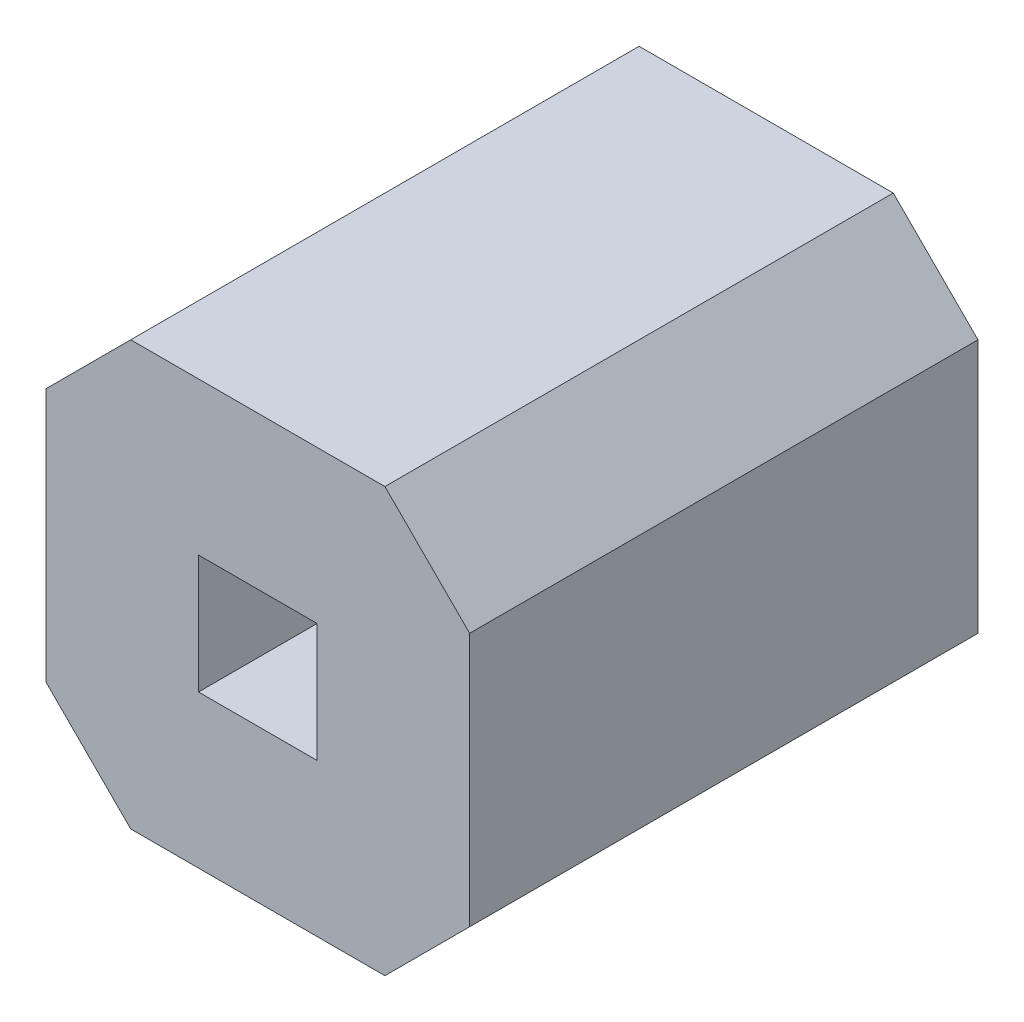
ISO-10303-21;
HEADER;
FILE_DESCRIPTION(('STEP AP214'),'2;1');
FILE_NAME('part.step','',(''),(''),'','','');
FILE_SCHEMA(('AUTOMOTIVE_DESIGN { 1 0 10303 214 1 1 1 1 }'));
ENDSEC;
DATA;
#1=APPLICATION_CONTEXT('core data for automotive mechanical design processes');
#2=APPLICATION_PROTOCOL_DEFINITION('international standard','automotive_design',2000,#1);
#3=PRODUCT_CONTEXT('',#1,'mechanical');
#4=PRODUCT('Part','Part','',(#3));
#5=PRODUCT_RELATED_PRODUCT_CATEGORY('part','',(#4));
#6=PRODUCT_DEFINITION_FORMATION('','',#4);
#7=PRODUCT_DEFINITION_CONTEXT('part definition',#1,'design');
#8=PRODUCT_DEFINITION('design','',#6,#7);
#9=PRODUCT_DEFINITION_SHAPE('','',#8);
#10=(LENGTH_UNIT() NAMED_UNIT(*) SI_UNIT(.MILLI.,.METRE.));
#11=(NAMED_UNIT(*) PLANE_ANGLE_UNIT() SI_UNIT($,.RADIAN.));
#12=(NAMED_UNIT(*) SI_UNIT($,.STERADIAN.) SOLID_ANGLE_UNIT());
#13=UNCERTAINTY_MEASURE_WITH_UNIT(LENGTH_MEASURE(1.E-05),#10,'distance_accuracy_value','');
#14=(GEOMETRIC_REPRESENTATION_CONTEXT(3) GLOBAL_UNCERTAINTY_ASSIGNED_CONTEXT((#13)) GLOBAL_UNIT_ASSIGNED_CONTEXT((#10,
#11,#12)) REPRESENTATION_CONTEXT('',''));
#15=CARTESIAN_POINT('',(0.,0.,0.));
#16=DIRECTION('',(0.,0.,1.));
#17=DIRECTION('',(1.,0.,0.));
#18=AXIS2_PLACEMENT_3D('',#15,#16,#17);
#19=CARTESIAN_POINT('',(33.58984299793,37.4,3.24));
#20=DIRECTION('',(0.,1.,0.));
#21=DIRECTION('',(1.,0.,0.));
#22=AXIS2_PLACEMENT_3D('',#19,#20,#21);
#23=PLANE('',#22);
#24=DIRECTION('',(0.,0.,-1.));
#25=VECTOR('',#24,1.);
#26=CARTESIAN_POINT('',(33.33584299794,37.40000000001,3.24000000001));
#27=LINE('',#26,#25);
#28=CARTESIAN_POINT('',(33.33584299793,37.4,3.24));
#29=VERTEX_POINT('',#28);
#30=CARTESIAN_POINT('',(33.33584299793,37.4,1.716));
#31=VERTEX_POINT('',#30);
#32=EDGE_CURVE('E39',#29,#31,#27,.T.);
#33=ORIENTED_EDGE('',*,*,#32,.F.);
#34=DIRECTION('',(-1.,0.,0.));
#35=VECTOR('',#34,1.);
#36=CARTESIAN_POINT('',(33.33584299794,37.40000000001,3.24000000001));
#37=LINE('',#36,#35);
#38=CARTESIAN_POINT('',(32.57384299793,37.4,3.24));
#39=VERTEX_POINT('',#38);
#40=EDGE_CURVE('E11',#29,#39,#37,.T.);
#41=ORIENTED_EDGE('',*,*,#40,.T.);
#42=DIRECTION('',(0.,0.,1.));
#43=VECTOR('',#42,1.);
#44=CARTESIAN_POINT('',(32.57384299794,37.40000000001,1.71600000001));
#45=LINE('',#44,#43);
#46=CARTESIAN_POINT('',(32.57384299793,37.4,1.716));
#47=VERTEX_POINT('',#46);
#48=EDGE_CURVE('E190',#47,#39,#45,.T.);
#49=ORIENTED_EDGE('',*,*,#48,.F.);
#50=DIRECTION('',(-1.,0.,0.));
#51=VECTOR('',#50,1.);
#52=CARTESIAN_POINT('',(33.33584299794,37.40000000001,1.71600000001));
#53=LINE('',#52,#51);
#54=EDGE_CURVE('E226',#31,#47,#53,.T.);
#55=ORIENTED_EDGE('',*,*,#54,.F.);
#56=EDGE_LOOP('',(#33,#41,#49,#55));
#57=FACE_BOUND('',#56,.T.);
#58=ADVANCED_FACE('F17',(#57),#23,.F.);
#59=CARTESIAN_POINT('',(32.31984299793,37.4,1.716));
#60=DIRECTION('',(0.,0.,-1.));
#61=DIRECTION('',(0.,-1.,0.));
#62=AXIS2_PLACEMENT_3D('',#59,#60,#61);
#63=PLANE('',#62);
#64=DIRECTION('',(-0.707106781186498,-0.707106781186598,0.));
#65=VECTOR('',#64,1.);
#66=CARTESIAN_POINT('',(33.58984299794,37.65400000001,1.71600000001));
#67=LINE('',#66,#65);
#68=CARTESIAN_POINT('',(33.58984299793,37.654,1.716));
#69=VERTEX_POINT('',#68);
#70=EDGE_CURVE('E28',#69,#31,#67,.T.);
#71=ORIENTED_EDGE('',*,*,#70,.T.);
#72=ORIENTED_EDGE('',*,*,#54,.T.);
#73=DIRECTION('',(-0.707106781186498,0.707106781186598,0.));
#74=VECTOR('',#73,1.);
#75=CARTESIAN_POINT('',(32.57384299794,37.40000000001,1.71600000001));
#76=LINE('',#75,#74);
#77=CARTESIAN_POINT('',(32.31984299793,37.654,1.716));
#78=VERTEX_POINT('',#77);
#79=EDGE_CURVE('E195',#47,#78,#76,.T.);
#80=ORIENTED_EDGE('',*,*,#79,.T.);
#81=DIRECTION('',(0.,1.,0.));
#82=VECTOR('',#81,1.);
#83=CARTESIAN_POINT('',(32.31984299794,37.65400000001,1.71600000001));
#84=LINE('',#83,#82);
#85=CARTESIAN_POINT('',(32.31984299793,38.416,1.716));
#86=VERTEX_POINT('',#85);
#87=EDGE_CURVE('E192',#78,#86,#84,.T.);
#88=ORIENTED_EDGE('',*,*,#87,.T.);
#89=DIRECTION('',(0.707106781186548,0.707106781186548,0.));
#90=VECTOR('',#89,1.);
#91=CARTESIAN_POINT('',(32.31984299794,38.41600000001,1.71600000001));
#92=LINE('',#91,#90);
#93=CARTESIAN_POINT('',(32.57384299793,38.67,1.716));
#94=VERTEX_POINT('',#93);
#95=EDGE_CURVE('E196',#86,#94,#92,.T.);
#96=ORIENTED_EDGE('',*,*,#95,.T.);
#97=DIRECTION('',(1.,0.,0.));
#98=VECTOR('',#97,1.);
#99=CARTESIAN_POINT('',(32.57384299794,38.67000000001,1.71600000001));
#100=LINE('',#99,#98);
#101=CARTESIAN_POINT('',(33.33584299793,38.67,1.716));
#102=VERTEX_POINT('',#101);
#103=EDGE_CURVE('E244',#94,#102,#100,.T.);
#104=ORIENTED_EDGE('',*,*,#103,.T.);
#105=DIRECTION('',(0.707106781186498,-0.707106781186598,0.));
#106=VECTOR('',#105,1.);
#107=CARTESIAN_POINT('',(33.33584299794,38.67000000001,1.71600000001));
#108=LINE('',#107,#106);
#109=CARTESIAN_POINT('',(33.58984299793,38.416,1.716));
#110=VERTEX_POINT('',#109);
#111=EDGE_CURVE('E185',#102,#110,#108,.T.);
#112=ORIENTED_EDGE('',*,*,#111,.T.);
#113=DIRECTION('',(0.,-1.,0.));
#114=VECTOR('',#113,1.);
#115=CARTESIAN_POINT('',(33.58984299794,38.41600000001,1.71600000001));
#116=LINE('',#115,#114);
#117=EDGE_CURVE('E129',#110,#69,#116,.T.);
#118=ORIENTED_EDGE('',*,*,#117,.T.);
#119=EDGE_LOOP('',(#71,#72,#80,#88,#96,#104,#112,#118));
#120=FACE_BOUND('',#119,.T.);
#121=DIRECTION('',(0.,-1.,0.));
#122=VECTOR('',#121,1.);
#123=CARTESIAN_POINT('',(33.13264299794,38.21280000001,1.71600000001));
#124=LINE('',#123,#122);
#125=CARTESIAN_POINT('',(33.13264299793,38.2128,1.716));
#126=VERTEX_POINT('',#125);
#127=CARTESIAN_POINT('',(33.13264299793,37.8572,1.716));
#128=VERTEX_POINT('',#127);
#129=EDGE_CURVE('E176',#126,#128,#124,.T.);
#130=ORIENTED_EDGE('',*,*,#129,.F.);
#131=DIRECTION('',(1.,0.,0.));
#132=VECTOR('',#131,1.);
#133=CARTESIAN_POINT('',(32.77704299794,38.21280000001,1.71600000001));
#134=LINE('',#133,#132);
#135=CARTESIAN_POINT('',(32.77704299793,38.2128,1.716));
#136=VERTEX_POINT('',#135);
#137=EDGE_CURVE('E118',#136,#126,#134,.T.);
#138=ORIENTED_EDGE('',*,*,#137,.F.);
#139=DIRECTION('',(0.,1.,0.));
#140=VECTOR('',#139,1.);
#141=CARTESIAN_POINT('',(32.77704299794,37.85720000001,1.71600000001));
#142=LINE('',#141,#140);
#143=CARTESIAN_POINT('',(32.77704299793,37.8572,1.716));
#144=VERTEX_POINT('',#143);
#145=EDGE_CURVE('E174',#144,#136,#142,.T.);
#146=ORIENTED_EDGE('',*,*,#145,.F.);
#147=DIRECTION('',(-1.,0.,0.));
#148=VECTOR('',#147,1.);
#149=CARTESIAN_POINT('',(33.13264299794,37.85720000001,1.71600000001));
#150=LINE('',#149,#148);
#151=EDGE_CURVE('E257',#128,#144,#150,.T.);
#152=ORIENTED_EDGE('',*,*,#151,.F.);
#153=EDGE_LOOP('',(#130,#138,#146,#152));
#154=FACE_BOUND('',#153,.T.);
#155=ADVANCED_FACE('F301',(#120,#154),#63,.T.);
#156=CARTESIAN_POINT('',(33.13264299793,37.8572,1.716));
#157=DIRECTION('',(0.,-1.,0.));
#158=DIRECTION('',(0.,0.,-1.));
#159=AXIS2_PLACEMENT_3D('',#156,#157,#158);
#160=PLANE('',#159);
#161=DIRECTION('',(0.,0.,-1.));
#162=VECTOR('',#161,1.);
#163=CARTESIAN_POINT('',(33.13264299794,37.85720000001,3.24000000001));
#164=LINE('',#163,#162);
#165=CARTESIAN_POINT('',(33.13264299793,37.8572,3.24));
#166=VERTEX_POINT('',#165);
#167=EDGE_CURVE('E254',#166,#128,#164,.T.);
#168=ORIENTED_EDGE('',*,*,#167,.T.);
#169=ORIENTED_EDGE('',*,*,#151,.T.);
#170=DIRECTION('',(0.,0.,-1.));
#171=VECTOR('',#170,1.);
#172=CARTESIAN_POINT('',(32.77704299794,37.85720000001,3.24000000001));
#173=LINE('',#172,#171);
#174=CARTESIAN_POINT('',(32.77704299793,37.8572,3.24));
#175=VERTEX_POINT('',#174);
#176=EDGE_CURVE('E94',#175,#144,#173,.T.);
#177=ORIENTED_EDGE('',*,*,#176,.F.);
#178=DIRECTION('',(-1.,0.,0.));
#179=VECTOR('',#178,1.);
#180=CARTESIAN_POINT('',(33.13264299794,37.85720000001,3.24000000001));
#181=LINE('',#180,#179);
#182=EDGE_CURVE('E100',#166,#175,#181,.T.);
#183=ORIENTED_EDGE('',*,*,#182,.F.);
#184=EDGE_LOOP('',(#168,#169,#177,#183));
#185=FACE_BOUND('',#184,.T.);
#186=ADVANCED_FACE('F308',(#185),#160,.F.);
#187=CARTESIAN_POINT('',(32.31984299793,37.4,3.24));
#188=DIRECTION('',(0.,0.,-1.));
#189=DIRECTION('',(0.,-1.,0.));
#190=AXIS2_PLACEMENT_3D('',#187,#188,#189);
#191=PLANE('',#190);
#192=DIRECTION('',(0.707106781186498,0.707106781186598,0.));
#193=VECTOR('',#192,1.);
#194=CARTESIAN_POINT('',(33.33584299794,37.40000000001,3.24000000001));
#195=LINE('',#194,#193);
#196=CARTESIAN_POINT('',(33.58984299793,37.654,3.24));
#197=VERTEX_POINT('',#196);
#198=EDGE_CURVE('E21',#29,#197,#195,.T.);
#199=ORIENTED_EDGE('',*,*,#198,.T.);
#200=DIRECTION('',(0.,-1.,0.));
#201=VECTOR('',#200,1.);
#202=CARTESIAN_POINT('',(33.58984299794,38.41600000001,3.24000000001));
#203=LINE('',#202,#201);
#204=CARTESIAN_POINT('',(33.58984299793,38.416,3.24));
#205=VERTEX_POINT('',#204);
#206=EDGE_CURVE('E212',#205,#197,#203,.T.);
#207=ORIENTED_EDGE('',*,*,#206,.F.);
#208=DIRECTION('',(-0.707106781186498,0.707106781186598,0.));
#209=VECTOR('',#208,1.);
#210=CARTESIAN_POINT('',(33.58984299794,38.41600000001,3.24000000001));
#211=LINE('',#210,#209);
#212=CARTESIAN_POINT('',(33.33584299793,38.67,3.24));
#213=VERTEX_POINT('',#212);
#214=EDGE_CURVE('E225',#205,#213,#211,.T.);
#215=ORIENTED_EDGE('',*,*,#214,.T.);
#216=DIRECTION('',(1.,0.,0.));
#217=VECTOR('',#216,1.);
#218=CARTESIAN_POINT('',(32.57384299794,38.67000000001,3.24000000001));
#219=LINE('',#218,#217);
#220=CARTESIAN_POINT('',(32.57384299793,38.67,3.24));
#221=VERTEX_POINT('',#220);
#222=EDGE_CURVE('E207',#221,#213,#219,.T.);
#223=ORIENTED_EDGE('',*,*,#222,.F.);
#224=DIRECTION('',(-0.707106781186548,-0.707106781186548,0.));
#225=VECTOR('',#224,1.);
#226=CARTESIAN_POINT('',(32.57384299794,38.67000000001,3.24000000001));
#227=LINE('',#226,#225);
#228=CARTESIAN_POINT('',(32.31984299793,38.416,3.24));
#229=VERTEX_POINT('',#228);
#230=EDGE_CURVE('E221',#221,#229,#227,.T.);
#231=ORIENTED_EDGE('',*,*,#230,.T.);
#232=DIRECTION('',(0.,1.,0.));
#233=VECTOR('',#232,1.);
#234=CARTESIAN_POINT('',(32.31984299794,37.65400000001,3.24000000001));
#235=LINE('',#234,#233);
#236=CARTESIAN_POINT('',(32.31984299793,37.654,3.24));
#237=VERTEX_POINT('',#236);
#238=EDGE_CURVE('E213',#237,#229,#235,.T.);
#239=ORIENTED_EDGE('',*,*,#238,.F.);
#240=DIRECTION('',(0.707106781186498,-0.707106781186598,0.));
#241=VECTOR('',#240,1.);
#242=CARTESIAN_POINT('',(32.31984299794,37.65400000001,3.24000000001));
#243=LINE('',#242,#241);
#244=EDGE_CURVE('E202',#237,#39,#243,.T.);
#245=ORIENTED_EDGE('',*,*,#244,.T.);
#246=ORIENTED_EDGE('',*,*,#40,.F.);
#247=EDGE_LOOP('',(#199,#207,#215,#223,#231,#239,#245,#246));
#248=FACE_BOUND('',#247,.T.);
#249=ORIENTED_EDGE('',*,*,#182,.T.);
#250=DIRECTION('',(0.,1.,0.));
#251=VECTOR('',#250,1.);
#252=CARTESIAN_POINT('',(32.77704299794,37.85720000001,3.24000000001));
#253=LINE('',#252,#251);
#254=CARTESIAN_POINT('',(32.77704299793,38.2128,3.24));
#255=VERTEX_POINT('',#254);
#256=EDGE_CURVE('E166',#175,#255,#253,.T.);
#257=ORIENTED_EDGE('',*,*,#256,.T.);
#258=DIRECTION('',(1.,0.,0.));
#259=VECTOR('',#258,1.);
#260=CARTESIAN_POINT('',(32.77704299794,38.21280000001,3.24000000001));
#261=LINE('',#260,#259);
#262=CARTESIAN_POINT('',(33.13264299793,38.2128,3.24));
#263=VERTEX_POINT('',#262);
#264=EDGE_CURVE('E158',#255,#263,#261,.T.);
#265=ORIENTED_EDGE('',*,*,#264,.T.);
#266=DIRECTION('',(0.,-1.,0.));
#267=VECTOR('',#266,1.);
#268=CARTESIAN_POINT('',(33.13264299794,38.21280000001,3.24000000001));
#269=LINE('',#268,#267);
#270=EDGE_CURVE('E154',#263,#166,#269,.T.);
#271=ORIENTED_EDGE('',*,*,#270,.T.);
#272=EDGE_LOOP('',(#249,#257,#265,#271));
#273=FACE_BOUND('',#272,.T.);
#274=ADVANCED_FACE('F169',(#248,#273),#191,.F.);
#275=CARTESIAN_POINT('',(33.13264299793,37.8572,1.716));
#276=DIRECTION('',(1.,0.,0.));
#277=DIRECTION('',(0.,1.,0.));
#278=AXIS2_PLACEMENT_3D('',#275,#276,#277);
#279=PLANE('',#278);
#280=DIRECTION('',(0.,0.,-1.));
#281=VECTOR('',#280,1.);
#282=CARTESIAN_POINT('',(33.13264299794,38.21280000001,3.24000000001));
#283=LINE('',#282,#281);
#284=EDGE_CURVE('E163',#263,#126,#283,.T.);
#285=ORIENTED_EDGE('',*,*,#284,.T.);
#286=ORIENTED_EDGE('',*,*,#129,.T.);
#287=ORIENTED_EDGE('',*,*,#167,.F.);
#288=ORIENTED_EDGE('',*,*,#270,.F.);
#289=EDGE_LOOP('',(#285,#286,#287,#288));
#290=FACE_BOUND('',#289,.T.);
#291=ADVANCED_FACE('F313',(#290),#279,.F.);
#292=CARTESIAN_POINT('',(33.13264299793,38.2128,1.716));
#293=DIRECTION('',(0.,1.,0.));
#294=DIRECTION('',(1.,0.,0.));
#295=AXIS2_PLACEMENT_3D('',#292,#293,#294);
#296=PLANE('',#295);
#297=DIRECTION('',(0.,0.,-1.));
#298=VECTOR('',#297,1.);
#299=CARTESIAN_POINT('',(32.77704299794,38.21280000001,3.24000000001));
#300=LINE('',#299,#298);
#301=EDGE_CURVE('E162',#255,#136,#300,.T.);
#302=ORIENTED_EDGE('',*,*,#301,.T.);
#303=ORIENTED_EDGE('',*,*,#137,.T.);
#304=ORIENTED_EDGE('',*,*,#284,.F.);
#305=ORIENTED_EDGE('',*,*,#264,.F.);
#306=EDGE_LOOP('',(#302,#303,#304,#305));
#307=FACE_BOUND('',#306,.T.);
#308=ADVANCED_FACE('F160',(#307),#296,.F.);
#309=CARTESIAN_POINT('',(32.77704299793,37.8572,1.716));
#310=DIRECTION('',(-1.,0.,0.));
#311=DIRECTION('',(0.,0.,1.));
#312=AXIS2_PLACEMENT_3D('',#309,#310,#311);
#313=PLANE('',#312);
#314=ORIENTED_EDGE('',*,*,#176,.T.);
#315=ORIENTED_EDGE('',*,*,#145,.T.);
#316=ORIENTED_EDGE('',*,*,#301,.F.);
#317=ORIENTED_EDGE('',*,*,#256,.F.);
#318=EDGE_LOOP('',(#314,#315,#316,#317));
#319=FACE_BOUND('',#318,.T.);
#320=ADVANCED_FACE('F173',(#319),#313,.F.);
#321=CARTESIAN_POINT('',(32.57384299793,37.4,3.24));
#322=DIRECTION('',(0.707106781186598,0.707106781186498,0.));
#323=DIRECTION('',(0.,0.,-1.));
#324=AXIS2_PLACEMENT_3D('',#321,#322,#323);
#325=PLANE('',#324);
#326=DIRECTION('',(0.,0.,-1.));
#327=VECTOR('',#326,1.);
#328=CARTESIAN_POINT('',(32.31984299794,37.65400000001,3.24000000001));
#329=LINE('',#328,#327);
#330=EDGE_CURVE('E187',#237,#78,#329,.T.);
#331=ORIENTED_EDGE('',*,*,#330,.T.);
#332=ORIENTED_EDGE('',*,*,#79,.F.);
#333=ORIENTED_EDGE('',*,*,#48,.T.);
#334=ORIENTED_EDGE('',*,*,#244,.F.);
#335=EDGE_LOOP('',(#331,#332,#333,#334));
#336=FACE_BOUND('',#335,.T.);
#337=ADVANCED_FACE('F298',(#336),#325,.F.);
#338=CARTESIAN_POINT('',(32.31984299793,37.4,3.24));
#339=DIRECTION('',(1.,0.,0.));
#340=DIRECTION('',(0.,1.,0.));
#341=AXIS2_PLACEMENT_3D('',#338,#339,#340);
#342=PLANE('',#341);
#343=ORIENTED_EDGE('',*,*,#330,.F.);
#344=ORIENTED_EDGE('',*,*,#238,.T.);
#345=DIRECTION('',(0.,0.,1.));
#346=VECTOR('',#345,1.);
#347=CARTESIAN_POINT('',(32.31984299794,38.41600000001,1.71600000001));
#348=LINE('',#347,#346);
#349=EDGE_CURVE('E233',#86,#229,#348,.T.);
#350=ORIENTED_EDGE('',*,*,#349,.F.);
#351=ORIENTED_EDGE('',*,*,#87,.F.);
#352=EDGE_LOOP('',(#343,#344,#350,#351));
#353=FACE_BOUND('',#352,.T.);
#354=ADVANCED_FACE('F295',(#353),#342,.F.);
#355=CARTESIAN_POINT('',(32.31984299793,38.416,3.24));
#356=DIRECTION('',(0.707106781186498,-0.707106781186598,0.));
#357=DIRECTION('',(0.,0.,-1.));
#358=AXIS2_PLACEMENT_3D('',#355,#356,#357);
#359=PLANE('',#358);
#360=DIRECTION('',(0.,0.,-1.));
#361=VECTOR('',#360,1.);
#362=CARTESIAN_POINT('',(32.57384299794,38.67000000001,3.24000000001));
#363=LINE('',#362,#361);
#364=EDGE_CURVE('E216',#221,#94,#363,.T.);
#365=ORIENTED_EDGE('',*,*,#364,.T.);
#366=ORIENTED_EDGE('',*,*,#95,.F.);
#367=ORIENTED_EDGE('',*,*,#349,.T.);
#368=ORIENTED_EDGE('',*,*,#230,.F.);
#369=EDGE_LOOP('',(#365,#366,#367,#368));
#370=FACE_BOUND('',#369,.T.);
#371=ADVANCED_FACE('F291',(#370),#359,.F.);
#372=CARTESIAN_POINT('',(33.58984299793,38.67,3.24));
#373=DIRECTION('',(0.,-1.,0.));
#374=DIRECTION('',(0.,0.,-1.));
#375=AXIS2_PLACEMENT_3D('',#372,#373,#374);
#376=PLANE('',#375);
#377=ORIENTED_EDGE('',*,*,#364,.F.);
#378=ORIENTED_EDGE('',*,*,#222,.T.);
#379=DIRECTION('',(0.,0.,1.));
#380=VECTOR('',#379,1.);
#381=CARTESIAN_POINT('',(33.33584299794,38.67000000001,1.71600000001));
#382=LINE('',#381,#380);
#383=EDGE_CURVE('E208',#102,#213,#382,.T.);
#384=ORIENTED_EDGE('',*,*,#383,.F.);
#385=ORIENTED_EDGE('',*,*,#103,.F.);
#386=EDGE_LOOP('',(#377,#378,#384,#385));
#387=FACE_BOUND('',#386,.T.);
#388=ADVANCED_FACE('F19',(#387),#376,.F.);
#389=CARTESIAN_POINT('',(33.33584299793,38.67,3.24));
#390=DIRECTION('',(-0.707106781186598,-0.707106781186498,0.));
#391=DIRECTION('',(-0.707106781186498,0.707106781186598,0.));
#392=AXIS2_PLACEMENT_3D('',#389,#390,#391);
#393=PLANE('',#392);
#394=DIRECTION('',(0.,0.,-1.));
#395=VECTOR('',#394,1.);
#396=CARTESIAN_POINT('',(33.58984299794,38.41600000001,3.24000000001));
#397=LINE('',#396,#395);
#398=EDGE_CURVE('E203',#205,#110,#397,.T.);
#399=ORIENTED_EDGE('',*,*,#398,.T.);
#400=ORIENTED_EDGE('',*,*,#111,.F.);
#401=ORIENTED_EDGE('',*,*,#383,.T.);
#402=ORIENTED_EDGE('',*,*,#214,.F.);
#403=EDGE_LOOP('',(#399,#400,#401,#402));
#404=FACE_BOUND('',#403,.T.);
#405=ADVANCED_FACE('F335',(#404),#393,.F.);
#406=CARTESIAN_POINT('',(33.58984299793,37.4,3.24));
#407=DIRECTION('',(-1.,0.,0.));
#408=DIRECTION('',(0.,0.,1.));
#409=AXIS2_PLACEMENT_3D('',#406,#407,#408);
#410=PLANE('',#409);
#411=DIRECTION('',(0.,0.,1.));
#412=VECTOR('',#411,1.);
#413=CARTESIAN_POINT('',(33.58984299794,37.65400000001,1.71600000001));
#414=LINE('',#413,#412);
#415=EDGE_CURVE('E250',#69,#197,#414,.T.);
#416=ORIENTED_EDGE('',*,*,#415,.F.);
#417=ORIENTED_EDGE('',*,*,#117,.F.);
#418=ORIENTED_EDGE('',*,*,#398,.F.);
#419=ORIENTED_EDGE('',*,*,#206,.T.);
#420=EDGE_LOOP('',(#416,#417,#418,#419));
#421=FACE_BOUND('',#420,.T.);
#422=ADVANCED_FACE('F269',(#421),#410,.F.);
#423=CARTESIAN_POINT('',(33.58984299793,37.654,3.24));
#424=DIRECTION('',(-0.707106781186498,0.707106781186598,0.));
#425=DIRECTION('',(0.,0.,1.));
#426=AXIS2_PLACEMENT_3D('',#423,#424,#425);
#427=PLANE('',#426);
#428=ORIENTED_EDGE('',*,*,#32,.T.);
#429=ORIENTED_EDGE('',*,*,#70,.F.);
#430=ORIENTED_EDGE('',*,*,#415,.T.);
#431=ORIENTED_EDGE('',*,*,#198,.F.);
#432=EDGE_LOOP('',(#428,#429,#430,#431));
#433=FACE_BOUND('',#432,.T.);
#434=ADVANCED_FACE('F266',(#433),#427,.F.);
#435=CLOSED_SHELL('',(#58,#155,#186,#274,#291,#308,#320,#337,#354,#371,#388,#405,#422,#434));
#436=MANIFOLD_SOLID_BREP('B1',#435);
#437=ADVANCED_BREP_SHAPE_REPRESENTATION('',(#18,#436),#14);
#438=SHAPE_DEFINITION_REPRESENTATION(#9,#437);
ENDSEC;
END-ISO-10303-21;
